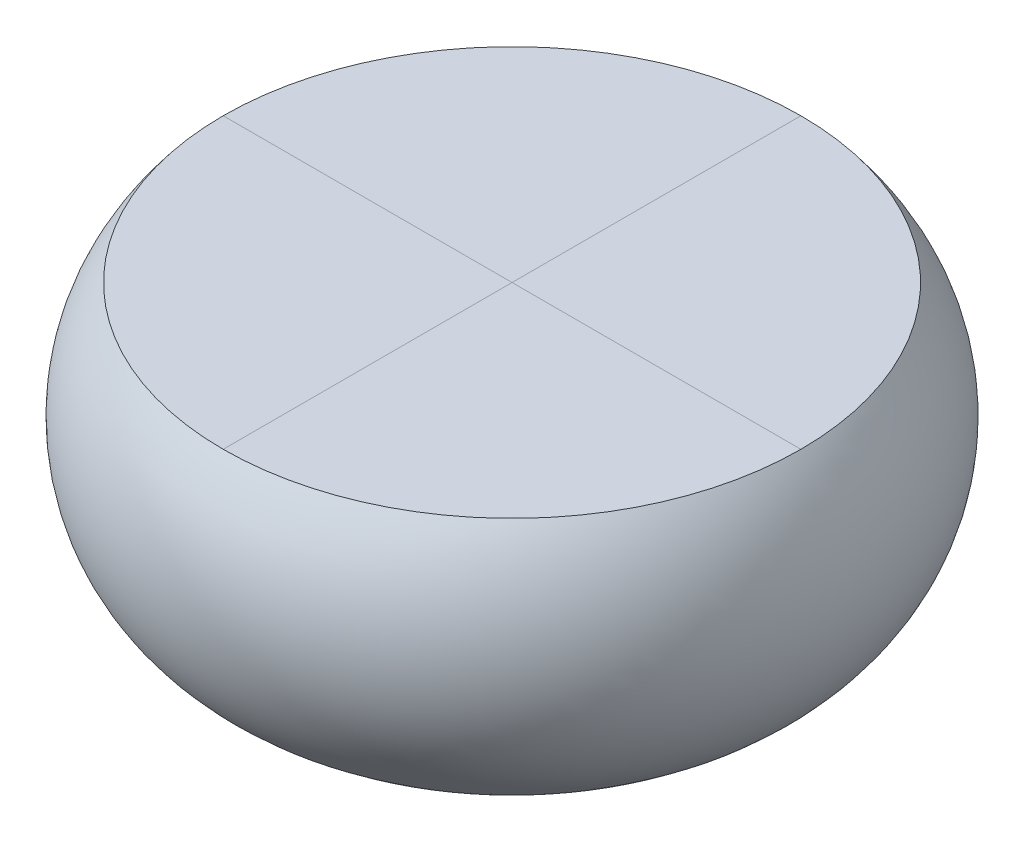
ISO-10303-21;
HEADER;
FILE_DESCRIPTION(('STEP AP214'),'2;1');
FILE_NAME('part.step','',(''),(''),'','','');
FILE_SCHEMA(('AUTOMOTIVE_DESIGN { 1 0 10303 214 1 1 1 1 }'));
ENDSEC;
DATA;
#1=APPLICATION_CONTEXT('core data for automotive mechanical design processes');
#2=APPLICATION_PROTOCOL_DEFINITION('international standard','automotive_design',2000,#1);
#3=PRODUCT_CONTEXT('',#1,'mechanical');
#4=PRODUCT('Part','Part','',(#3));
#5=PRODUCT_RELATED_PRODUCT_CATEGORY('part','',(#4));
#6=PRODUCT_DEFINITION_FORMATION('','',#4);
#7=PRODUCT_DEFINITION_CONTEXT('part definition',#1,'design');
#8=PRODUCT_DEFINITION('design','',#6,#7);
#9=PRODUCT_DEFINITION_SHAPE('','',#8);
#10=(LENGTH_UNIT() NAMED_UNIT(*) SI_UNIT(.MILLI.,.METRE.));
#11=(NAMED_UNIT(*) PLANE_ANGLE_UNIT() SI_UNIT($,.RADIAN.));
#12=(NAMED_UNIT(*) SI_UNIT($,.STERADIAN.) SOLID_ANGLE_UNIT());
#13=UNCERTAINTY_MEASURE_WITH_UNIT(LENGTH_MEASURE(1.E-05),#10,'distance_accuracy_value','');
#14=(GEOMETRIC_REPRESENTATION_CONTEXT(3) GLOBAL_UNCERTAINTY_ASSIGNED_CONTEXT((#13)) GLOBAL_UNIT_ASSIGNED_CONTEXT((#10,
#11,#12)) REPRESENTATION_CONTEXT('',''));
#15=CARTESIAN_POINT('',(0.,0.,0.));
#16=DIRECTION('',(0.,0.,1.));
#17=DIRECTION('',(1.,0.,0.));
#18=AXIS2_PLACEMENT_3D('',#15,#16,#17);
#19=CARTESIAN_POINT('',(115.350199906915,118.59409895004,0.));
#20=DIRECTION('',(0.,-1.,0.));
#21=DIRECTION('',(0.,0.,-1.));
#22=AXIS2_PLACEMENT_3D('',#19,#20,#21);
#23=PLANE('',#22);
#24=DIRECTION('',(-1.,0.,0.));
#25=VECTOR('',#24,1.);
#26=CARTESIAN_POINT('',(115.350199906915,118.59409895004,0.));
#27=LINE('',#26,#25);
#28=CARTESIAN_POINT('',(0.,118.59409895004,0.));
#29=VERTEX_POINT('',#28);
#30=CARTESIAN_POINT('',(-115.350199906915,118.59409895004,0.));
#31=VERTEX_POINT('',#30);
#32=EDGE_CURVE('E11',#29,#31,#27,.T.);
#33=ORIENTED_EDGE('',*,*,#32,.F.);
#34=DIRECTION('',(0.,0.,-1.));
#35=VECTOR('',#34,1.);
#36=CARTESIAN_POINT('',(0.,118.59409895004,0.));
#37=LINE('',#36,#35);
#38=CARTESIAN_POINT('',(0.,118.59409895004,-115.350199906915));
#39=VERTEX_POINT('',#38);
#40=EDGE_CURVE('E84',#29,#39,#37,.T.);
#41=ORIENTED_EDGE('',*,*,#40,.T.);
#42=CARTESIAN_POINT('',(0.,118.59409895004,0.));
#43=DIRECTION('',(0.,1.,0.));
#44=DIRECTION('',(0.,0.,1.));
#45=AXIS2_PLACEMENT_3D('',#42,#43,#44);
#46=CIRCLE('',#45,115.350199906915);
#47=EDGE_CURVE('E75',#39,#31,#46,.T.);
#48=ORIENTED_EDGE('',*,*,#47,.T.);
#49=EDGE_LOOP('',(#33,#41,#48));
#50=FACE_BOUND('',#49,.T.);
#51=ADVANCED_FACE('F39',(#50),#23,.F.);
#52=DIRECTION('',(-1.,0.,0.));
#53=VECTOR('',#52,1.);
#54=CARTESIAN_POINT('',(115.350199906915,118.59409895004,0.));
#55=LINE('',#54,#53);
#56=CARTESIAN_POINT('',(115.350199906915,118.59409895004,0.));
#57=VERTEX_POINT('',#56);
#58=EDGE_CURVE('E43',#57,#29,#55,.T.);
#59=ORIENTED_EDGE('',*,*,#58,.F.);
#60=EDGE_CURVE('E78',#57,#39,#46,.T.);
#61=ORIENTED_EDGE('',*,*,#60,.T.);
#62=ORIENTED_EDGE('',*,*,#40,.F.);
#63=EDGE_LOOP('',(#59,#61,#62));
#64=FACE_BOUND('',#63,.T.);
#65=ADVANCED_FACE('F91',(#64),#23,.F.);
#66=CARTESIAN_POINT('',(0.,118.59409895004,115.350199906915));
#67=VERTEX_POINT('',#66);
#68=EDGE_CURVE('E79',#67,#57,#46,.T.);
#69=ORIENTED_EDGE('',*,*,#68,.T.);
#70=ORIENTED_EDGE('',*,*,#58,.T.);
#71=EDGE_CURVE('E70',#67,#29,#37,.T.);
#72=ORIENTED_EDGE('',*,*,#71,.F.);
#73=EDGE_LOOP('',(#69,#70,#72));
#74=FACE_BOUND('',#73,.T.);
#75=ADVANCED_FACE('F82',(#74),#23,.F.);
#76=CARTESIAN_POINT('',(0.,72.4523717981406,0.));
#77=DIRECTION('',(0.,1.,0.));
#78=DIRECTION('',(0.,0.,1.));
#79=AXIS2_PLACEMENT_3D('',#76,#77,#78);
#80=DEGENERATE_TOROIDAL_SURFACE('',#79,58.0136,73.597178434,.T.);
#81=ORIENTED_EDGE('',*,*,#68,.F.);
#82=EDGE_CURVE('E67',#31,#67,#46,.T.);
#83=ORIENTED_EDGE('',*,*,#82,.F.);
#84=ORIENTED_EDGE('',*,*,#47,.F.);
#85=ORIENTED_EDGE('',*,*,#60,.F.);
#86=EDGE_LOOP('',(#81,#83,#84,#85));
#87=FACE_BOUND('',#86,.T.);
#88=CARTESIAN_POINT('',(0.,0.,0.));
#89=DIRECTION('',(0.,1.,0.));
#90=DIRECTION('',(0.,0.,1.));
#91=AXIS2_PLACEMENT_3D('',#88,#89,#90);
#92=CIRCLE('',#91,70.9441256764769);
#93=CARTESIAN_POINT('',(0.,0.,70.9441256764769));
#94=VERTEX_POINT('',#93);
#95=EDGE_CURVE('E76',#94,#94,#92,.T.);
#96=ORIENTED_EDGE('',*,*,#95,.T.);
#97=EDGE_LOOP('',(#96));
#98=FACE_BOUND('',#97,.T.);
#99=ADVANCED_FACE('F41',(#87,#98),#80,.T.);
#100=ORIENTED_EDGE('',*,*,#71,.T.);
#101=ORIENTED_EDGE('',*,*,#32,.T.);
#102=ORIENTED_EDGE('',*,*,#82,.T.);
#103=EDGE_LOOP('',(#100,#101,#102));
#104=FACE_BOUND('',#103,.T.);
#105=ADVANCED_FACE('F69',(#104),#23,.F.);
#106=CARTESIAN_POINT('',(0.,0.,0.));
#107=DIRECTION('',(0.,1.,0.));
#108=DIRECTION('',(0.,0.,1.));
#109=AXIS2_PLACEMENT_3D('',#106,#107,#108);
#110=PLANE('',#109);
#111=ORIENTED_EDGE('',*,*,#95,.F.);
#112=EDGE_LOOP('',(#111));
#113=FACE_BOUND('',#112,.T.);
#114=ADVANCED_FACE('F99',(#113),#110,.F.);
#115=CLOSED_SHELL('',(#51,#65,#75,#99,#105,#114));
#116=MANIFOLD_SOLID_BREP('B2',#115);
#117=ADVANCED_BREP_SHAPE_REPRESENTATION('',(#18,#116),#14);
#118=SHAPE_DEFINITION_REPRESENTATION(#9,#117);
ENDSEC;
END-ISO-10303-21;
